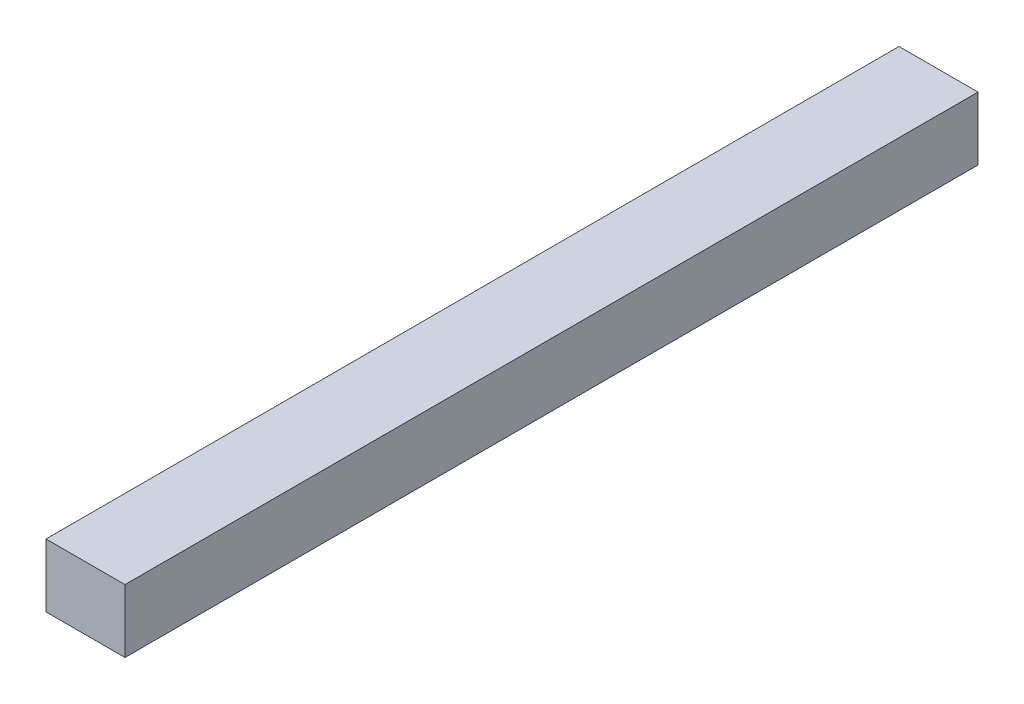
ISO-10303-21;
HEADER;
FILE_DESCRIPTION(('STEP AP214'),'2;1');
FILE_NAME('part.step','',(''),(''),'','','');
FILE_SCHEMA(('AUTOMOTIVE_DESIGN { 1 0 10303 214 1 1 1 1 }'));
ENDSEC;
DATA;
#1=APPLICATION_CONTEXT('core data for automotive mechanical design processes');
#2=APPLICATION_PROTOCOL_DEFINITION('international standard','automotive_design',2000,#1);
#3=PRODUCT_CONTEXT('',#1,'mechanical');
#4=PRODUCT('Part','Part','',(#3));
#5=PRODUCT_RELATED_PRODUCT_CATEGORY('part','',(#4));
#6=PRODUCT_DEFINITION_FORMATION('','',#4);
#7=PRODUCT_DEFINITION_CONTEXT('part definition',#1,'design');
#8=PRODUCT_DEFINITION('design','',#6,#7);
#9=PRODUCT_DEFINITION_SHAPE('','',#8);
#10=(LENGTH_UNIT() NAMED_UNIT(*) SI_UNIT(.MILLI.,.METRE.));
#11=(NAMED_UNIT(*) PLANE_ANGLE_UNIT() SI_UNIT($,.RADIAN.));
#12=(NAMED_UNIT(*) SI_UNIT($,.STERADIAN.) SOLID_ANGLE_UNIT());
#13=UNCERTAINTY_MEASURE_WITH_UNIT(LENGTH_MEASURE(1.E-05),#10,'distance_accuracy_value','');
#14=(GEOMETRIC_REPRESENTATION_CONTEXT(3) GLOBAL_UNCERTAINTY_ASSIGNED_CONTEXT((#13)) GLOBAL_UNIT_ASSIGNED_CONTEXT((#10,
#11,#12)) REPRESENTATION_CONTEXT('',''));
#15=CARTESIAN_POINT('',(0.,0.,0.));
#16=DIRECTION('',(0.,0.,1.));
#17=DIRECTION('',(1.,0.,0.));
#18=AXIS2_PLACEMENT_3D('',#15,#16,#17);
#19=CARTESIAN_POINT('',(0.,0.,540.));
#20=DIRECTION('',(1.,0.,0.));
#21=DIRECTION('',(0.,0.,-1.));
#22=AXIS2_PLACEMENT_3D('',#19,#20,#21);
#23=PLANE('',#22);
#24=DIRECTION('',(0.,-1.,0.));
#25=VECTOR('',#24,1.);
#26=CARTESIAN_POINT('',(0.,0.,0.));
#27=LINE('',#26,#25);
#28=CARTESIAN_POINT('',(0.,40.,0.));
#29=VERTEX_POINT('',#28);
#30=CARTESIAN_POINT('',(0.,0.,0.));
#31=VERTEX_POINT('',#30);
#32=EDGE_CURVE('E96',#29,#31,#27,.T.);
#33=ORIENTED_EDGE('',*,*,#32,.T.);
#34=DIRECTION('',(0.,0.,-1.));
#35=VECTOR('',#34,1.);
#36=CARTESIAN_POINT('',(0.,0.,540.));
#37=LINE('',#36,#35);
#38=CARTESIAN_POINT('',(0.,0.,540.));
#39=VERTEX_POINT('',#38);
#40=EDGE_CURVE('E11',#39,#31,#37,.T.);
#41=ORIENTED_EDGE('',*,*,#40,.F.);
#42=DIRECTION('',(0.,-1.,0.));
#43=VECTOR('',#42,1.);
#44=CARTESIAN_POINT('',(0.,0.,540.));
#45=LINE('',#44,#43);
#46=CARTESIAN_POINT('',(0.,40.,540.));
#47=VERTEX_POINT('',#46);
#48=EDGE_CURVE('E84',#47,#39,#45,.T.);
#49=ORIENTED_EDGE('',*,*,#48,.F.);
#50=DIRECTION('',(0.,0.,-1.));
#51=VECTOR('',#50,1.);
#52=CARTESIAN_POINT('',(0.,40.,540.));
#53=LINE('',#52,#51);
#54=EDGE_CURVE('E92',#47,#29,#53,.T.);
#55=ORIENTED_EDGE('',*,*,#54,.T.);
#56=EDGE_LOOP('',(#33,#41,#49,#55));
#57=FACE_BOUND('',#56,.T.);
#58=ADVANCED_FACE('F33',(#57),#23,.F.);
#59=CARTESIAN_POINT('',(0.,0.,540.));
#60=DIRECTION('',(0.,1.,0.));
#61=DIRECTION('',(0.,0.,1.));
#62=AXIS2_PLACEMENT_3D('',#59,#60,#61);
#63=PLANE('',#62);
#64=DIRECTION('',(1.,0.,0.));
#65=VECTOR('',#64,1.);
#66=CARTESIAN_POINT('',(0.,0.,0.));
#67=LINE('',#66,#65);
#68=CARTESIAN_POINT('',(50.,0.,0.));
#69=VERTEX_POINT('',#68);
#70=EDGE_CURVE('E88',#31,#69,#67,.T.);
#71=ORIENTED_EDGE('',*,*,#70,.T.);
#72=DIRECTION('',(0.,0.,-1.));
#73=VECTOR('',#72,1.);
#74=CARTESIAN_POINT('',(50.,0.,540.));
#75=LINE('',#74,#73);
#76=CARTESIAN_POINT('',(50.,0.,540.));
#77=VERTEX_POINT('',#76);
#78=EDGE_CURVE('E41',#77,#69,#75,.T.);
#79=ORIENTED_EDGE('',*,*,#78,.F.);
#80=DIRECTION('',(1.,0.,0.));
#81=VECTOR('',#80,1.);
#82=CARTESIAN_POINT('',(0.,0.,540.));
#83=LINE('',#82,#81);
#84=EDGE_CURVE('E79',#39,#77,#83,.T.);
#85=ORIENTED_EDGE('',*,*,#84,.F.);
#86=ORIENTED_EDGE('',*,*,#40,.T.);
#87=EDGE_LOOP('',(#71,#79,#85,#86));
#88=FACE_BOUND('',#87,.T.);
#89=ADVANCED_FACE('F87',(#88),#63,.F.);
#90=CARTESIAN_POINT('',(50.,0.,540.));
#91=DIRECTION('',(-1.,0.,0.));
#92=DIRECTION('',(0.,0.,1.));
#93=AXIS2_PLACEMENT_3D('',#90,#91,#92);
#94=PLANE('',#93);
#95=DIRECTION('',(0.,1.,0.));
#96=VECTOR('',#95,1.);
#97=CARTESIAN_POINT('',(50.,0.,0.));
#98=LINE('',#97,#96);
#99=CARTESIAN_POINT('',(50.,40.,0.));
#100=VERTEX_POINT('',#99);
#101=EDGE_CURVE('E66',#69,#100,#98,.T.);
#102=ORIENTED_EDGE('',*,*,#101,.T.);
#103=DIRECTION('',(0.,0.,-1.));
#104=VECTOR('',#103,1.);
#105=CARTESIAN_POINT('',(50.,40.,540.));
#106=LINE('',#105,#104);
#107=CARTESIAN_POINT('',(50.,40.,540.));
#108=VERTEX_POINT('',#107);
#109=EDGE_CURVE('E89',#108,#100,#106,.T.);
#110=ORIENTED_EDGE('',*,*,#109,.F.);
#111=DIRECTION('',(0.,1.,0.));
#112=VECTOR('',#111,1.);
#113=CARTESIAN_POINT('',(50.,0.,540.));
#114=LINE('',#113,#112);
#115=EDGE_CURVE('E82',#77,#108,#114,.T.);
#116=ORIENTED_EDGE('',*,*,#115,.F.);
#117=ORIENTED_EDGE('',*,*,#78,.T.);
#118=EDGE_LOOP('',(#102,#110,#116,#117));
#119=FACE_BOUND('',#118,.T.);
#120=ADVANCED_FACE('F90',(#119),#94,.F.);
#121=CARTESIAN_POINT('',(0.,40.,540.));
#122=DIRECTION('',(0.,-1.,0.));
#123=DIRECTION('',(0.,0.,-1.));
#124=AXIS2_PLACEMENT_3D('',#121,#122,#123);
#125=PLANE('',#124);
#126=DIRECTION('',(-1.,0.,0.));
#127=VECTOR('',#126,1.);
#128=CARTESIAN_POINT('',(0.,40.,0.));
#129=LINE('',#128,#127);
#130=EDGE_CURVE('E72',#100,#29,#129,.T.);
#131=ORIENTED_EDGE('',*,*,#130,.T.);
#132=ORIENTED_EDGE('',*,*,#54,.F.);
#133=DIRECTION('',(-1.,0.,0.));
#134=VECTOR('',#133,1.);
#135=CARTESIAN_POINT('',(0.,40.,540.));
#136=LINE('',#135,#134);
#137=EDGE_CURVE('E49',#108,#47,#136,.T.);
#138=ORIENTED_EDGE('',*,*,#137,.F.);
#139=ORIENTED_EDGE('',*,*,#109,.T.);
#140=EDGE_LOOP('',(#131,#132,#138,#139));
#141=FACE_BOUND('',#140,.T.);
#142=ADVANCED_FACE('F103',(#141),#125,.F.);
#143=CARTESIAN_POINT('',(0.,0.,540.));
#144=DIRECTION('',(0.,0.,-1.));
#145=DIRECTION('',(-1.,0.,0.));
#146=AXIS2_PLACEMENT_3D('',#143,#144,#145);
#147=PLANE('',#146);
#148=ORIENTED_EDGE('',*,*,#48,.T.);
#149=ORIENTED_EDGE('',*,*,#84,.T.);
#150=ORIENTED_EDGE('',*,*,#115,.T.);
#151=ORIENTED_EDGE('',*,*,#137,.T.);
#152=EDGE_LOOP('',(#148,#149,#150,#151));
#153=FACE_BOUND('',#152,.T.);
#154=ADVANCED_FACE('F80',(#153),#147,.F.);
#155=CARTESIAN_POINT('',(0.,0.,0.));
#156=DIRECTION('',(0.,0.,-1.));
#157=DIRECTION('',(-1.,0.,0.));
#158=AXIS2_PLACEMENT_3D('',#155,#156,#157);
#159=PLANE('',#158);
#160=ORIENTED_EDGE('',*,*,#32,.F.);
#161=ORIENTED_EDGE('',*,*,#130,.F.);
#162=ORIENTED_EDGE('',*,*,#101,.F.);
#163=ORIENTED_EDGE('',*,*,#70,.F.);
#164=EDGE_LOOP('',(#160,#161,#162,#163));
#165=FACE_BOUND('',#164,.T.);
#166=ADVANCED_FACE('F106',(#165),#159,.T.);
#167=CLOSED_SHELL('',(#58,#89,#120,#142,#154,#166));
#168=MANIFOLD_SOLID_BREP('B2',#167);
#169=ADVANCED_BREP_SHAPE_REPRESENTATION('',(#18,#168),#14);
#170=SHAPE_DEFINITION_REPRESENTATION(#9,#169);
ENDSEC;
END-ISO-10303-21;
